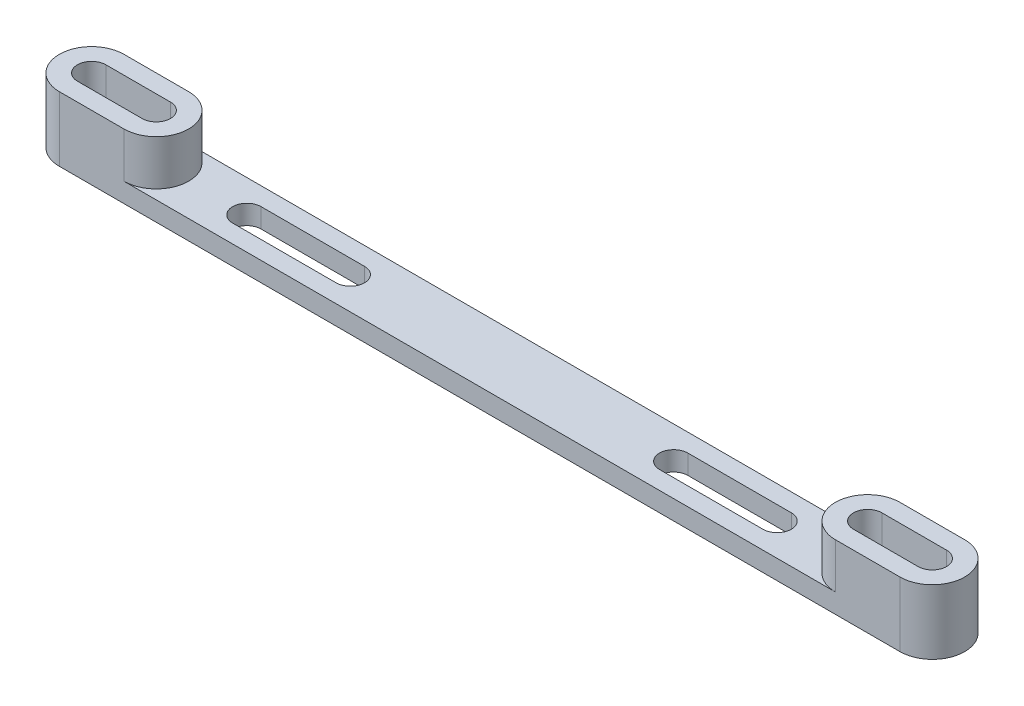
ISO-10303-21;
HEADER;
FILE_DESCRIPTION(('STEP AP214'),'2;1');
FILE_NAME('part.step','',(''),(''),'','','');
FILE_SCHEMA(('AUTOMOTIVE_DESIGN { 1 0 10303 214 1 1 1 1 }'));
ENDSEC;
DATA;
#1=APPLICATION_CONTEXT('core data for automotive mechanical design processes');
#2=APPLICATION_PROTOCOL_DEFINITION('international standard','automotive_design',2000,#1);
#3=PRODUCT_CONTEXT('',#1,'mechanical');
#4=PRODUCT('Part','Part','',(#3));
#5=PRODUCT_RELATED_PRODUCT_CATEGORY('part','',(#4));
#6=PRODUCT_DEFINITION_FORMATION('','',#4);
#7=PRODUCT_DEFINITION_CONTEXT('part definition',#1,'design');
#8=PRODUCT_DEFINITION('design','',#6,#7);
#9=PRODUCT_DEFINITION_SHAPE('','',#8);
#10=(LENGTH_UNIT() NAMED_UNIT(*) SI_UNIT(.MILLI.,.METRE.));
#11=(NAMED_UNIT(*) PLANE_ANGLE_UNIT() SI_UNIT($,.RADIAN.));
#12=(NAMED_UNIT(*) SI_UNIT($,.STERADIAN.) SOLID_ANGLE_UNIT());
#13=UNCERTAINTY_MEASURE_WITH_UNIT(LENGTH_MEASURE(1.E-05),#10,'distance_accuracy_value','');
#14=(GEOMETRIC_REPRESENTATION_CONTEXT(3) GLOBAL_UNCERTAINTY_ASSIGNED_CONTEXT((#13)) GLOBAL_UNIT_ASSIGNED_CONTEXT((#10,
#11,#12)) REPRESENTATION_CONTEXT('',''));
#15=CARTESIAN_POINT('',(0.,0.,0.));
#16=DIRECTION('',(0.,0.,1.));
#17=DIRECTION('',(1.,0.,0.));
#18=AXIS2_PLACEMENT_3D('',#15,#16,#17);
#19=CARTESIAN_POINT('',(-65.,3.,0.));
#20=DIRECTION('',(0.,1.,0.));
#21=DIRECTION('',(0.,0.,1.));
#22=AXIS2_PLACEMENT_3D('',#19,#20,#21);
#23=PLANE('',#22);
#24=CARTESIAN_POINT('',(41.,3.,0.));
#25=DIRECTION('',(0.,1.,0.));
#26=DIRECTION('',(0.,0.,-1.));
#27=AXIS2_PLACEMENT_3D('',#24,#25,#26);
#28=CIRCLE('',#27,2.20000000000001);
#29=CARTESIAN_POINT('',(41.,3.,2.20000000000003));
#30=VERTEX_POINT('',#29);
#31=CARTESIAN_POINT('',(41.,3.,-2.19999999999999));
#32=VERTEX_POINT('',#31);
#33=EDGE_CURVE('E53',#30,#32,#28,.T.);
#34=ORIENTED_EDGE('',*,*,#33,.F.);
#35=DIRECTION('',(1.,0.,0.));
#36=VECTOR('',#35,1.);
#37=CARTESIAN_POINT('',(41.,3.,2.20000000000003));
#38=LINE('',#37,#36);
#39=CARTESIAN_POINT('',(25.,3.,2.20000000000003));
#40=VERTEX_POINT('',#39);
#41=EDGE_CURVE('E217',#40,#30,#38,.T.);
#42=ORIENTED_EDGE('',*,*,#41,.F.);
#43=CARTESIAN_POINT('',(25.,3.,0.));
#44=DIRECTION('',(0.,1.,0.));
#45=DIRECTION('',(0.,0.,-1.));
#46=AXIS2_PLACEMENT_3D('',#43,#44,#45);
#47=CIRCLE('',#46,2.20000000000001);
#48=CARTESIAN_POINT('',(25.,3.,-2.19999999999998));
#49=VERTEX_POINT('',#48);
#50=EDGE_CURVE('E220',#49,#40,#47,.T.);
#51=ORIENTED_EDGE('',*,*,#50,.F.);
#52=DIRECTION('',(-1.,0.,0.));
#53=VECTOR('',#52,1.);
#54=CARTESIAN_POINT('',(41.,3.,-2.19999999999999));
#55=LINE('',#54,#53);
#56=EDGE_CURVE('E226',#32,#49,#55,.T.);
#57=ORIENTED_EDGE('',*,*,#56,.F.);
#58=EDGE_LOOP('',(#34,#42,#51,#57));
#59=FACE_BOUND('',#58,.T.);
#60=CARTESIAN_POINT('',(-41.,3.,0.));
#61=DIRECTION('',(0.,1.,0.));
#62=DIRECTION('',(0.,0.,1.));
#63=AXIS2_PLACEMENT_3D('',#60,#61,#62);
#64=CIRCLE('',#63,2.20000000000001);
#65=CARTESIAN_POINT('',(-41.,3.,-2.19999999999998));
#66=VERTEX_POINT('',#65);
#67=CARTESIAN_POINT('',(-41.,3.,2.20000000000004));
#68=VERTEX_POINT('',#67);
#69=EDGE_CURVE('E232',#66,#68,#64,.T.);
#70=ORIENTED_EDGE('',*,*,#69,.F.);
#71=DIRECTION('',(-1.,0.,0.));
#72=VECTOR('',#71,1.);
#73=CARTESIAN_POINT('',(-41.,3.,-2.19999999999998));
#74=LINE('',#73,#72);
#75=CARTESIAN_POINT('',(-25.,3.,-2.19999999999998));
#76=VERTEX_POINT('',#75);
#77=EDGE_CURVE('E240',#76,#66,#74,.T.);
#78=ORIENTED_EDGE('',*,*,#77,.F.);
#79=CARTESIAN_POINT('',(-25.,3.,0.));
#80=DIRECTION('',(0.,1.,0.));
#81=DIRECTION('',(0.,0.,1.));
#82=AXIS2_PLACEMENT_3D('',#79,#80,#81);
#83=CIRCLE('',#82,2.20000000000001);
#84=CARTESIAN_POINT('',(-25.,3.,2.20000000000003));
#85=VERTEX_POINT('',#84);
#86=EDGE_CURVE('E254',#85,#76,#83,.T.);
#87=ORIENTED_EDGE('',*,*,#86,.F.);
#88=DIRECTION('',(1.,0.,0.));
#89=VECTOR('',#88,1.);
#90=CARTESIAN_POINT('',(-41.,3.,2.20000000000004));
#91=LINE('',#90,#89);
#92=EDGE_CURVE('E251',#68,#85,#91,.T.);
#93=ORIENTED_EDGE('',*,*,#92,.F.);
#94=EDGE_LOOP('',(#70,#78,#87,#93));
#95=FACE_BOUND('',#94,.T.);
#96=DIRECTION('',(1.,0.,0.));
#97=VECTOR('',#96,1.);
#98=CARTESIAN_POINT('',(-65.,3.,4.99999999999998));
#99=LINE('',#98,#97);
#100=CARTESIAN_POINT('',(-55.,3.,4.99999999999997));
#101=VERTEX_POINT('',#100);
#102=CARTESIAN_POINT('',(55.,3.,4.99999999999995));
#103=VERTEX_POINT('',#102);
#104=EDGE_CURVE('E369',#101,#103,#99,.T.);
#105=ORIENTED_EDGE('',*,*,#104,.T.);
#106=CARTESIAN_POINT('',(55.,3.,0.));
#107=DIRECTION('',(0.,1.,0.));
#108=DIRECTION('',(0.,0.,-1.));
#109=AXIS2_PLACEMENT_3D('',#106,#107,#108);
#110=CIRCLE('',#109,5.);
#111=CARTESIAN_POINT('',(55.,3.,-5.));
#112=VERTEX_POINT('',#111);
#113=EDGE_CURVE('E325',#112,#103,#110,.T.);
#114=ORIENTED_EDGE('',*,*,#113,.F.);
#115=DIRECTION('',(-1.,0.,0.));
#116=VECTOR('',#115,1.);
#117=CARTESIAN_POINT('',(-65.,3.,-4.99999999999998));
#118=LINE('',#117,#116);
#119=CARTESIAN_POINT('',(-55.,3.,-5.));
#120=VERTEX_POINT('',#119);
#121=EDGE_CURVE('E39',#112,#120,#118,.T.);
#122=ORIENTED_EDGE('',*,*,#121,.T.);
#123=CARTESIAN_POINT('',(-55.,3.,0.));
#124=DIRECTION('',(0.,1.,0.));
#125=DIRECTION('',(0.,0.,1.));
#126=AXIS2_PLACEMENT_3D('',#123,#124,#125);
#127=CIRCLE('',#126,5.);
#128=EDGE_CURVE('E350',#101,#120,#127,.T.);
#129=ORIENTED_EDGE('',*,*,#128,.F.);
#130=EDGE_LOOP('',(#105,#114,#122,#129));
#131=FACE_BOUND('',#130,.T.);
#132=ADVANCED_FACE('F35',(#59,#95,#131),#23,.T.);
#133=CARTESIAN_POINT('',(-65.,3.,0.));
#134=DIRECTION('',(0.,-1.,0.));
#135=DIRECTION('',(0.,0.,-1.));
#136=AXIS2_PLACEMENT_3D('',#133,#134,#135);
#137=CYLINDRICAL_SURFACE('',#136,4.99999999999998);
#138=CARTESIAN_POINT('',(-65.,0.,0.));
#139=DIRECTION('',(0.,1.,0.));
#140=DIRECTION('',(0.,0.,1.));
#141=AXIS2_PLACEMENT_3D('',#138,#139,#140);
#142=CIRCLE('',#141,4.99999999999998);
#143=CARTESIAN_POINT('',(-65.,0.,-4.99999999999998));
#144=VERTEX_POINT('',#143);
#145=CARTESIAN_POINT('',(-65.,0.,4.99999999999998));
#146=VERTEX_POINT('',#145);
#147=EDGE_CURVE('E376',#144,#146,#142,.T.);
#148=ORIENTED_EDGE('',*,*,#147,.T.);
#149=DIRECTION('',(0.,-1.,0.));
#150=VECTOR('',#149,1.);
#151=CARTESIAN_POINT('',(-65.,3.,4.99999999999998));
#152=LINE('',#151,#150);
#153=CARTESIAN_POINT('',(-65.,10.,5.));
#154=VERTEX_POINT('',#153);
#155=EDGE_CURVE('E11',#154,#146,#152,.T.);
#156=ORIENTED_EDGE('',*,*,#155,.F.);
#157=CARTESIAN_POINT('',(-65.,10.,0.));
#158=DIRECTION('',(0.,1.,0.));
#159=DIRECTION('',(0.,0.,1.));
#160=AXIS2_PLACEMENT_3D('',#157,#158,#159);
#161=CIRCLE('',#160,5.);
#162=CARTESIAN_POINT('',(-65.,10.,-5.));
#163=VERTEX_POINT('',#162);
#164=EDGE_CURVE('E351',#163,#154,#161,.T.);
#165=ORIENTED_EDGE('',*,*,#164,.F.);
#166=DIRECTION('',(0.,-1.,0.));
#167=VECTOR('',#166,1.);
#168=CARTESIAN_POINT('',(-65.,3.,-4.99999999999998));
#169=LINE('',#168,#167);
#170=EDGE_CURVE('E394',#163,#144,#169,.T.);
#171=ORIENTED_EDGE('',*,*,#170,.T.);
#172=EDGE_LOOP('',(#148,#156,#165,#171));
#173=FACE_BOUND('',#172,.T.);
#174=ADVANCED_FACE('F37',(#173),#137,.T.);
#175=CARTESIAN_POINT('',(-65.,3.,4.99999999999998));
#176=DIRECTION('',(0.,0.,-1.));
#177=DIRECTION('',(-1.,0.,0.));
#178=AXIS2_PLACEMENT_3D('',#175,#176,#177);
#179=PLANE('',#178);
#180=DIRECTION('',(1.,0.,0.));
#181=VECTOR('',#180,1.);
#182=CARTESIAN_POINT('',(-65.,0.,4.99999999999998));
#183=LINE('',#182,#181);
#184=CARTESIAN_POINT('',(65.,0.,4.99999999999998));
#185=VERTEX_POINT('',#184);
#186=EDGE_CURVE('E382',#146,#185,#183,.T.);
#187=ORIENTED_EDGE('',*,*,#186,.T.);
#188=DIRECTION('',(0.,-1.,0.));
#189=VECTOR('',#188,1.);
#190=CARTESIAN_POINT('',(65.,3.,4.99999999999998));
#191=LINE('',#190,#189);
#192=CARTESIAN_POINT('',(65.,10.,4.99999999999998));
#193=VERTEX_POINT('',#192);
#194=EDGE_CURVE('E45',#193,#185,#191,.T.);
#195=ORIENTED_EDGE('',*,*,#194,.F.);
#196=DIRECTION('',(1.,0.,0.));
#197=VECTOR('',#196,1.);
#198=CARTESIAN_POINT('',(65.,10.,4.99999999999998));
#199=LINE('',#198,#197);
#200=CARTESIAN_POINT('',(55.,10.,4.99999999999999));
#201=VERTEX_POINT('',#200);
#202=EDGE_CURVE('E339',#201,#193,#199,.T.);
#203=ORIENTED_EDGE('',*,*,#202,.F.);
#204=DIRECTION('',(0.,-1.,0.));
#205=VECTOR('',#204,1.);
#206=CARTESIAN_POINT('',(55.,10.,4.99999999999999));
#207=LINE('',#206,#205);
#208=EDGE_CURVE('E342',#201,#103,#207,.T.);
#209=ORIENTED_EDGE('',*,*,#208,.T.);
#210=ORIENTED_EDGE('',*,*,#104,.F.);
#211=DIRECTION('',(0.,-1.,0.));
#212=VECTOR('',#211,1.);
#213=CARTESIAN_POINT('',(-55.,10.,5.));
#214=LINE('',#213,#212);
#215=CARTESIAN_POINT('',(-55.,10.,5.));
#216=VERTEX_POINT('',#215);
#217=EDGE_CURVE('E372',#216,#101,#214,.T.);
#218=ORIENTED_EDGE('',*,*,#217,.F.);
#219=DIRECTION('',(1.,0.,0.));
#220=VECTOR('',#219,1.);
#221=CARTESIAN_POINT('',(-65.,10.,5.));
#222=LINE('',#221,#220);
#223=EDGE_CURVE('E354',#154,#216,#222,.T.);
#224=ORIENTED_EDGE('',*,*,#223,.F.);
#225=ORIENTED_EDGE('',*,*,#155,.T.);
#226=EDGE_LOOP('',(#187,#195,#203,#209,#210,#218,#224,#225));
#227=FACE_BOUND('',#226,.T.);
#228=ADVANCED_FACE('F422',(#227),#179,.F.);
#229=CARTESIAN_POINT('',(65.,3.,0.));
#230=DIRECTION('',(0.,-1.,0.));
#231=DIRECTION('',(0.,0.,-1.));
#232=AXIS2_PLACEMENT_3D('',#229,#230,#231);
#233=CYLINDRICAL_SURFACE('',#232,4.99999999999998);
#234=CARTESIAN_POINT('',(65.,0.,0.));
#235=DIRECTION('',(0.,1.,0.));
#236=DIRECTION('',(0.,0.,1.));
#237=AXIS2_PLACEMENT_3D('',#234,#235,#236);
#238=CIRCLE('',#237,4.99999999999998);
#239=CARTESIAN_POINT('',(65.,0.,-5.));
#240=VERTEX_POINT('',#239);
#241=EDGE_CURVE('E387',#185,#240,#238,.T.);
#242=ORIENTED_EDGE('',*,*,#241,.T.);
#243=DIRECTION('',(0.,-1.,0.));
#244=VECTOR('',#243,1.);
#245=CARTESIAN_POINT('',(65.,3.,-5.));
#246=LINE('',#245,#244);
#247=CARTESIAN_POINT('',(65.,10.,-5.00000000000002));
#248=VERTEX_POINT('',#247);
#249=EDGE_CURVE('E396',#248,#240,#246,.T.);
#250=ORIENTED_EDGE('',*,*,#249,.F.);
#251=CARTESIAN_POINT('',(65.,10.,0.));
#252=DIRECTION('',(0.,1.,0.));
#253=DIRECTION('',(0.,0.,-1.));
#254=AXIS2_PLACEMENT_3D('',#251,#252,#253);
#255=CIRCLE('',#254,5.);
#256=EDGE_CURVE('E332',#193,#248,#255,.T.);
#257=ORIENTED_EDGE('',*,*,#256,.F.);
#258=ORIENTED_EDGE('',*,*,#194,.T.);
#259=EDGE_LOOP('',(#242,#250,#257,#258));
#260=FACE_BOUND('',#259,.T.);
#261=ADVANCED_FACE('F403',(#260),#233,.T.);
#262=CARTESIAN_POINT('',(-65.,3.,-4.99999999999998));
#263=DIRECTION('',(0.,0.,1.));
#264=DIRECTION('',(1.,0.,0.));
#265=AXIS2_PLACEMENT_3D('',#262,#263,#264);
#266=PLANE('',#265);
#267=DIRECTION('',(-1.,0.,0.));
#268=VECTOR('',#267,1.);
#269=CARTESIAN_POINT('',(-65.,0.,-4.99999999999998));
#270=LINE('',#269,#268);
#271=EDGE_CURVE('E392',#240,#144,#270,.T.);
#272=ORIENTED_EDGE('',*,*,#271,.T.);
#273=ORIENTED_EDGE('',*,*,#170,.F.);
#274=DIRECTION('',(-1.,0.,0.));
#275=VECTOR('',#274,1.);
#276=CARTESIAN_POINT('',(-65.,10.,-5.));
#277=LINE('',#276,#275);
#278=CARTESIAN_POINT('',(-55.,10.,-5.));
#279=VERTEX_POINT('',#278);
#280=EDGE_CURVE('E358',#279,#163,#277,.T.);
#281=ORIENTED_EDGE('',*,*,#280,.F.);
#282=DIRECTION('',(0.,-1.,0.));
#283=VECTOR('',#282,1.);
#284=CARTESIAN_POINT('',(-55.,10.,-5.));
#285=LINE('',#284,#283);
#286=EDGE_CURVE('E361',#279,#120,#285,.T.);
#287=ORIENTED_EDGE('',*,*,#286,.T.);
#288=ORIENTED_EDGE('',*,*,#121,.F.);
#289=DIRECTION('',(0.,-1.,0.));
#290=VECTOR('',#289,1.);
#291=CARTESIAN_POINT('',(55.,10.,-5.00000000000002));
#292=LINE('',#291,#290);
#293=CARTESIAN_POINT('',(55.,10.,-5.00000000000002));
#294=VERTEX_POINT('',#293);
#295=EDGE_CURVE('E347',#294,#112,#292,.T.);
#296=ORIENTED_EDGE('',*,*,#295,.F.);
#297=DIRECTION('',(-1.,0.,0.));
#298=VECTOR('',#297,1.);
#299=CARTESIAN_POINT('',(65.,10.,-5.00000000000002));
#300=LINE('',#299,#298);
#301=EDGE_CURVE('E335',#248,#294,#300,.T.);
#302=ORIENTED_EDGE('',*,*,#301,.F.);
#303=ORIENTED_EDGE('',*,*,#249,.T.);
#304=EDGE_LOOP('',(#272,#273,#281,#287,#288,#296,#302,#303));
#305=FACE_BOUND('',#304,.T.);
#306=ADVANCED_FACE('F409',(#305),#266,.F.);
#307=CARTESIAN_POINT('',(-65.,0.,0.));
#308=DIRECTION('',(0.,1.,0.));
#309=DIRECTION('',(0.,0.,1.));
#310=AXIS2_PLACEMENT_3D('',#307,#308,#309);
#311=PLANE('',#310);
#312=DIRECTION('',(1.,0.,0.));
#313=VECTOR('',#312,1.);
#314=CARTESIAN_POINT('',(41.,0.,2.20000000000003));
#315=LINE('',#314,#313);
#316=CARTESIAN_POINT('',(25.,0.,2.20000000000003));
#317=VERTEX_POINT('',#316);
#318=CARTESIAN_POINT('',(41.,0.,2.20000000000003));
#319=VERTEX_POINT('',#318);
#320=EDGE_CURVE('E207',#317,#319,#315,.T.);
#321=ORIENTED_EDGE('',*,*,#320,.T.);
#322=CARTESIAN_POINT('',(41.,0.,0.));
#323=DIRECTION('',(0.,1.,0.));
#324=DIRECTION('',(0.,0.,-1.));
#325=AXIS2_PLACEMENT_3D('',#322,#323,#324);
#326=CIRCLE('',#325,2.20000000000001);
#327=CARTESIAN_POINT('',(41.,0.,-2.19999999999999));
#328=VERTEX_POINT('',#327);
#329=EDGE_CURVE('E201',#319,#328,#326,.T.);
#330=ORIENTED_EDGE('',*,*,#329,.T.);
#331=DIRECTION('',(-1.,0.,0.));
#332=VECTOR('',#331,1.);
#333=CARTESIAN_POINT('',(41.,0.,-2.19999999999999));
#334=LINE('',#333,#332);
#335=CARTESIAN_POINT('',(25.,0.,-2.19999999999998));
#336=VERTEX_POINT('',#335);
#337=EDGE_CURVE('E210',#328,#336,#334,.T.);
#338=ORIENTED_EDGE('',*,*,#337,.T.);
#339=CARTESIAN_POINT('',(25.,0.,0.));
#340=DIRECTION('',(0.,1.,0.));
#341=DIRECTION('',(0.,0.,-1.));
#342=AXIS2_PLACEMENT_3D('',#339,#340,#341);
#343=CIRCLE('',#342,2.20000000000001);
#344=EDGE_CURVE('E61',#336,#317,#343,.T.);
#345=ORIENTED_EDGE('',*,*,#344,.T.);
#346=EDGE_LOOP('',(#321,#330,#338,#345));
#347=FACE_BOUND('',#346,.T.);
#348=DIRECTION('',(-1.,0.,0.));
#349=VECTOR('',#348,1.);
#350=CARTESIAN_POINT('',(-41.,0.,-2.19999999999998));
#351=LINE('',#350,#349);
#352=CARTESIAN_POINT('',(-25.,0.,-2.19999999999998));
#353=VERTEX_POINT('',#352);
#354=CARTESIAN_POINT('',(-41.,0.,-2.19999999999998));
#355=VERTEX_POINT('',#354);
#356=EDGE_CURVE('E246',#353,#355,#351,.T.);
#357=ORIENTED_EDGE('',*,*,#356,.T.);
#358=CARTESIAN_POINT('',(-41.,0.,0.));
#359=DIRECTION('',(0.,1.,0.));
#360=DIRECTION('',(0.,0.,1.));
#361=AXIS2_PLACEMENT_3D('',#358,#359,#360);
#362=CIRCLE('',#361,2.20000000000001);
#363=CARTESIAN_POINT('',(-41.,0.,2.20000000000004));
#364=VERTEX_POINT('',#363);
#365=EDGE_CURVE('E236',#355,#364,#362,.T.);
#366=ORIENTED_EDGE('',*,*,#365,.T.);
#367=DIRECTION('',(1.,0.,0.));
#368=VECTOR('',#367,1.);
#369=CARTESIAN_POINT('',(-41.,0.,2.20000000000004));
#370=LINE('',#369,#368);
#371=CARTESIAN_POINT('',(-25.,0.,2.20000000000004));
#372=VERTEX_POINT('',#371);
#373=EDGE_CURVE('E239',#364,#372,#370,.T.);
#374=ORIENTED_EDGE('',*,*,#373,.T.);
#375=CARTESIAN_POINT('',(-25.,0.,0.));
#376=DIRECTION('',(0.,1.,0.));
#377=DIRECTION('',(0.,0.,1.));
#378=AXIS2_PLACEMENT_3D('',#375,#376,#377);
#379=CIRCLE('',#378,2.20000000000001);
#380=EDGE_CURVE('E243',#372,#353,#379,.T.);
#381=ORIENTED_EDGE('',*,*,#380,.T.);
#382=EDGE_LOOP('',(#357,#366,#374,#381));
#383=FACE_BOUND('',#382,.T.);
#384=DIRECTION('',(1.,0.,0.));
#385=VECTOR('',#384,1.);
#386=CARTESIAN_POINT('',(65.,0.,2.20000000000004));
#387=LINE('',#386,#385);
#388=CARTESIAN_POINT('',(55.,0.,2.2));
#389=VERTEX_POINT('',#388);
#390=CARTESIAN_POINT('',(65.,0.,2.20000000000004));
#391=VERTEX_POINT('',#390);
#392=EDGE_CURVE('E278',#389,#391,#387,.T.);
#393=ORIENTED_EDGE('',*,*,#392,.T.);
#394=CARTESIAN_POINT('',(65.,0.,0.));
#395=DIRECTION('',(0.,1.,0.));
#396=DIRECTION('',(0.,0.,-1.));
#397=AXIS2_PLACEMENT_3D('',#394,#395,#396);
#398=CIRCLE('',#397,2.20000000000002);
#399=CARTESIAN_POINT('',(65.,0.,-2.19999999999999));
#400=VERTEX_POINT('',#399);
#401=EDGE_CURVE('E268',#391,#400,#398,.T.);
#402=ORIENTED_EDGE('',*,*,#401,.T.);
#403=DIRECTION('',(-1.,0.,0.));
#404=VECTOR('',#403,1.);
#405=CARTESIAN_POINT('',(65.,0.,-2.19999999999999));
#406=LINE('',#405,#404);
#407=CARTESIAN_POINT('',(55.,0.,-2.19999999999999));
#408=VERTEX_POINT('',#407);
#409=EDGE_CURVE('E271',#400,#408,#406,.T.);
#410=ORIENTED_EDGE('',*,*,#409,.T.);
#411=CARTESIAN_POINT('',(55.,0.,0.));
#412=DIRECTION('',(0.,1.,0.));
#413=DIRECTION('',(0.,0.,-1.));
#414=AXIS2_PLACEMENT_3D('',#411,#412,#413);
#415=CIRCLE('',#414,2.20000000000002);
#416=EDGE_CURVE('E275',#408,#389,#415,.T.);
#417=ORIENTED_EDGE('',*,*,#416,.T.);
#418=EDGE_LOOP('',(#393,#402,#410,#417));
#419=FACE_BOUND('',#418,.T.);
#420=DIRECTION('',(-1.,0.,0.));
#421=VECTOR('',#420,1.);
#422=CARTESIAN_POINT('',(-65.,0.,-2.19999999999998));
#423=LINE('',#422,#421);
#424=CARTESIAN_POINT('',(-55.,0.,-2.19999999999998));
#425=VERTEX_POINT('',#424);
#426=CARTESIAN_POINT('',(-65.,0.,-2.19999999999998));
#427=VERTEX_POINT('',#426);
#428=EDGE_CURVE('E310',#425,#427,#423,.T.);
#429=ORIENTED_EDGE('',*,*,#428,.T.);
#430=CARTESIAN_POINT('',(-65.,0.,0.));
#431=DIRECTION('',(0.,1.,0.));
#432=DIRECTION('',(0.,0.,1.));
#433=AXIS2_PLACEMENT_3D('',#430,#431,#432);
#434=CIRCLE('',#433,2.20000000000002);
#435=CARTESIAN_POINT('',(-65.,0.,2.20000000000006));
#436=VERTEX_POINT('',#435);
#437=EDGE_CURVE('E300',#427,#436,#434,.T.);
#438=ORIENTED_EDGE('',*,*,#437,.T.);
#439=DIRECTION('',(1.,0.,0.));
#440=VECTOR('',#439,1.);
#441=CARTESIAN_POINT('',(-65.,0.,2.20000000000006));
#442=LINE('',#441,#440);
#443=CARTESIAN_POINT('',(-55.,0.,2.20000000000006));
#444=VERTEX_POINT('',#443);
#445=EDGE_CURVE('E303',#436,#444,#442,.T.);
#446=ORIENTED_EDGE('',*,*,#445,.T.);
#447=CARTESIAN_POINT('',(-55.,0.,0.));
#448=DIRECTION('',(0.,1.,0.));
#449=DIRECTION('',(0.,0.,1.));
#450=AXIS2_PLACEMENT_3D('',#447,#448,#449);
#451=CIRCLE('',#450,2.20000000000002);
#452=EDGE_CURVE('E307',#444,#425,#451,.T.);
#453=ORIENTED_EDGE('',*,*,#452,.T.);
#454=EDGE_LOOP('',(#429,#438,#446,#453));
#455=FACE_BOUND('',#454,.T.);
#456=ORIENTED_EDGE('',*,*,#147,.F.);
#457=ORIENTED_EDGE('',*,*,#271,.F.);
#458=ORIENTED_EDGE('',*,*,#241,.F.);
#459=ORIENTED_EDGE('',*,*,#186,.F.);
#460=EDGE_LOOP('',(#456,#457,#458,#459));
#461=FACE_BOUND('',#460,.T.);
#462=ADVANCED_FACE('F214',(#347,#383,#419,#455,#461),#311,.F.);
#463=CARTESIAN_POINT('',(-55.,10.,0.));
#464=DIRECTION('',(0.,-1.,0.));
#465=DIRECTION('',(0.,0.,-1.));
#466=AXIS2_PLACEMENT_3D('',#463,#464,#465);
#467=CYLINDRICAL_SURFACE('',#466,5.);
#468=ORIENTED_EDGE('',*,*,#128,.T.);
#469=ORIENTED_EDGE('',*,*,#286,.F.);
#470=CARTESIAN_POINT('',(-55.,10.,0.));
#471=DIRECTION('',(0.,1.,0.));
#472=DIRECTION('',(0.,0.,1.));
#473=AXIS2_PLACEMENT_3D('',#470,#471,#472);
#474=CIRCLE('',#473,5.);
#475=EDGE_CURVE('E356',#216,#279,#474,.T.);
#476=ORIENTED_EDGE('',*,*,#475,.F.);
#477=ORIENTED_EDGE('',*,*,#217,.T.);
#478=EDGE_LOOP('',(#468,#469,#476,#477));
#479=FACE_BOUND('',#478,.T.);
#480=ADVANCED_FACE('F419',(#479),#467,.T.);
#481=CARTESIAN_POINT('',(-65.,10.,0.));
#482=DIRECTION('',(0.,1.,0.));
#483=DIRECTION('',(0.,0.,1.));
#484=AXIS2_PLACEMENT_3D('',#481,#482,#483);
#485=PLANE('',#484);
#486=CARTESIAN_POINT('',(-65.,10.,0.));
#487=DIRECTION('',(0.,1.,0.));
#488=DIRECTION('',(0.,0.,1.));
#489=AXIS2_PLACEMENT_3D('',#486,#487,#488);
#490=CIRCLE('',#489,2.20000000000002);
#491=CARTESIAN_POINT('',(-65.,10.,-2.19999999999998));
#492=VERTEX_POINT('',#491);
#493=CARTESIAN_POINT('',(-65.,10.,2.20000000000006));
#494=VERTEX_POINT('',#493);
#495=EDGE_CURVE('E293',#492,#494,#490,.T.);
#496=ORIENTED_EDGE('',*,*,#495,.F.);
#497=DIRECTION('',(-1.,0.,0.));
#498=VECTOR('',#497,1.);
#499=CARTESIAN_POINT('',(-65.,10.,-2.19999999999998));
#500=LINE('',#499,#498);
#501=CARTESIAN_POINT('',(-55.,10.,-2.19999999999998));
#502=VERTEX_POINT('',#501);
#503=EDGE_CURVE('E304',#502,#492,#500,.T.);
#504=ORIENTED_EDGE('',*,*,#503,.F.);
#505=CARTESIAN_POINT('',(-55.,10.,0.));
#506=DIRECTION('',(0.,1.,0.));
#507=DIRECTION('',(0.,0.,1.));
#508=AXIS2_PLACEMENT_3D('',#505,#506,#507);
#509=CIRCLE('',#508,2.20000000000002);
#510=CARTESIAN_POINT('',(-55.,10.,2.20000000000002));
#511=VERTEX_POINT('',#510);
#512=EDGE_CURVE('E318',#511,#502,#509,.T.);
#513=ORIENTED_EDGE('',*,*,#512,.F.);
#514=DIRECTION('',(1.,0.,0.));
#515=VECTOR('',#514,1.);
#516=CARTESIAN_POINT('',(-65.,10.,2.20000000000006));
#517=LINE('',#516,#515);
#518=EDGE_CURVE('E315',#494,#511,#517,.T.);
#519=ORIENTED_EDGE('',*,*,#518,.F.);
#520=EDGE_LOOP('',(#496,#504,#513,#519));
#521=FACE_BOUND('',#520,.T.);
#522=ORIENTED_EDGE('',*,*,#164,.T.);
#523=ORIENTED_EDGE('',*,*,#223,.T.);
#524=ORIENTED_EDGE('',*,*,#475,.T.);
#525=ORIENTED_EDGE('',*,*,#280,.T.);
#526=EDGE_LOOP('',(#522,#523,#524,#525));
#527=FACE_BOUND('',#526,.T.);
#528=ADVANCED_FACE('F415',(#521,#527),#485,.T.);
#529=CARTESIAN_POINT('',(55.,10.,0.));
#530=DIRECTION('',(0.,-1.,0.));
#531=DIRECTION('',(0.,0.,-1.));
#532=AXIS2_PLACEMENT_3D('',#529,#530,#531);
#533=CYLINDRICAL_SURFACE('',#532,5.);
#534=ORIENTED_EDGE('',*,*,#113,.T.);
#535=ORIENTED_EDGE('',*,*,#208,.F.);
#536=CARTESIAN_POINT('',(55.,10.,0.));
#537=DIRECTION('',(0.,1.,0.));
#538=DIRECTION('',(0.,0.,-1.));
#539=AXIS2_PLACEMENT_3D('',#536,#537,#538);
#540=CIRCLE('',#539,5.);
#541=EDGE_CURVE('E337',#294,#201,#540,.T.);
#542=ORIENTED_EDGE('',*,*,#541,.F.);
#543=ORIENTED_EDGE('',*,*,#295,.T.);
#544=EDGE_LOOP('',(#534,#535,#542,#543));
#545=FACE_BOUND('',#544,.T.);
#546=ADVANCED_FACE('F426',(#545),#533,.T.);
#547=CARTESIAN_POINT('',(65.,10.,0.));
#548=DIRECTION('',(0.,-1.,0.));
#549=DIRECTION('',(0.,0.,-1.));
#550=AXIS2_PLACEMENT_3D('',#547,#548,#549);
#551=PLANE('',#550);
#552=DIRECTION('',(-1.,0.,0.));
#553=VECTOR('',#552,1.);
#554=CARTESIAN_POINT('',(65.,10.,-2.19999999999999));
#555=LINE('',#554,#553);
#556=CARTESIAN_POINT('',(65.,10.,-2.19999999999999));
#557=VERTEX_POINT('',#556);
#558=CARTESIAN_POINT('',(55.,10.,-2.19999999999999));
#559=VERTEX_POINT('',#558);
#560=EDGE_CURVE('E283',#557,#559,#555,.T.);
#561=ORIENTED_EDGE('',*,*,#560,.F.);
#562=CARTESIAN_POINT('',(65.,10.,0.));
#563=DIRECTION('',(0.,1.,0.));
#564=DIRECTION('',(0.,0.,-1.));
#565=AXIS2_PLACEMENT_3D('',#562,#563,#564);
#566=CIRCLE('',#565,2.20000000000002);
#567=CARTESIAN_POINT('',(65.,10.,2.20000000000004));
#568=VERTEX_POINT('',#567);
#569=EDGE_CURVE('E261',#568,#557,#566,.T.);
#570=ORIENTED_EDGE('',*,*,#569,.F.);
#571=DIRECTION('',(1.,0.,0.));
#572=VECTOR('',#571,1.);
#573=CARTESIAN_POINT('',(65.,10.,2.20000000000004));
#574=LINE('',#573,#572);
#575=CARTESIAN_POINT('',(55.,10.,2.2));
#576=VERTEX_POINT('',#575);
#577=EDGE_CURVE('E272',#576,#568,#574,.T.);
#578=ORIENTED_EDGE('',*,*,#577,.F.);
#579=CARTESIAN_POINT('',(55.,10.,0.));
#580=DIRECTION('',(0.,1.,0.));
#581=DIRECTION('',(0.,0.,-1.));
#582=AXIS2_PLACEMENT_3D('',#579,#580,#581);
#583=CIRCLE('',#582,2.20000000000002);
#584=EDGE_CURVE('E286',#559,#576,#583,.T.);
#585=ORIENTED_EDGE('',*,*,#584,.F.);
#586=EDGE_LOOP('',(#561,#570,#578,#585));
#587=FACE_BOUND('',#586,.T.);
#588=ORIENTED_EDGE('',*,*,#256,.T.);
#589=ORIENTED_EDGE('',*,*,#301,.T.);
#590=ORIENTED_EDGE('',*,*,#541,.T.);
#591=ORIENTED_EDGE('',*,*,#202,.T.);
#592=EDGE_LOOP('',(#588,#589,#590,#591));
#593=FACE_BOUND('',#592,.T.);
#594=ADVANCED_FACE('F428',(#587,#593),#551,.F.);
#595=CARTESIAN_POINT('',(-65.,0.,0.));
#596=DIRECTION('',(0.,1.,0.));
#597=DIRECTION('',(0.,0.,1.));
#598=AXIS2_PLACEMENT_3D('',#595,#596,#597);
#599=CYLINDRICAL_SURFACE('',#598,2.20000000000002);
#600=ORIENTED_EDGE('',*,*,#495,.T.);
#601=DIRECTION('',(0.,1.,0.));
#602=VECTOR('',#601,1.);
#603=CARTESIAN_POINT('',(-65.,0.,2.20000000000006));
#604=LINE('',#603,#602);
#605=EDGE_CURVE('E313',#436,#494,#604,.T.);
#606=ORIENTED_EDGE('',*,*,#605,.F.);
#607=ORIENTED_EDGE('',*,*,#437,.F.);
#608=DIRECTION('',(0.,1.,0.));
#609=VECTOR('',#608,1.);
#610=CARTESIAN_POINT('',(-65.,0.,-2.19999999999998));
#611=LINE('',#610,#609);
#612=EDGE_CURVE('E323',#427,#492,#611,.T.);
#613=ORIENTED_EDGE('',*,*,#612,.T.);
#614=EDGE_LOOP('',(#600,#606,#607,#613));
#615=FACE_BOUND('',#614,.T.);
#616=ADVANCED_FACE('F430',(#615),#599,.F.);
#617=CARTESIAN_POINT('',(-65.,0.,-2.19999999999998));
#618=DIRECTION('',(0.,0.,-1.));
#619=DIRECTION('',(-1.,0.,0.));
#620=AXIS2_PLACEMENT_3D('',#617,#618,#619);
#621=PLANE('',#620);
#622=ORIENTED_EDGE('',*,*,#503,.T.);
#623=ORIENTED_EDGE('',*,*,#612,.F.);
#624=ORIENTED_EDGE('',*,*,#428,.F.);
#625=DIRECTION('',(0.,1.,0.));
#626=VECTOR('',#625,1.);
#627=CARTESIAN_POINT('',(-55.,0.,-2.19999999999998));
#628=LINE('',#627,#626);
#629=EDGE_CURVE('E326',#425,#502,#628,.T.);
#630=ORIENTED_EDGE('',*,*,#629,.T.);
#631=EDGE_LOOP('',(#622,#623,#624,#630));
#632=FACE_BOUND('',#631,.T.);
#633=ADVANCED_FACE('F437',(#632),#621,.F.);
#634=CARTESIAN_POINT('',(-55.,0.,0.));
#635=DIRECTION('',(0.,1.,0.));
#636=DIRECTION('',(0.,0.,1.));
#637=AXIS2_PLACEMENT_3D('',#634,#635,#636);
#638=CYLINDRICAL_SURFACE('',#637,2.20000000000002);
#639=ORIENTED_EDGE('',*,*,#512,.T.);
#640=ORIENTED_EDGE('',*,*,#629,.F.);
#641=ORIENTED_EDGE('',*,*,#452,.F.);
#642=DIRECTION('',(0.,1.,0.));
#643=VECTOR('',#642,1.);
#644=CARTESIAN_POINT('',(-55.,0.,2.20000000000002));
#645=LINE('',#644,#643);
#646=EDGE_CURVE('E328',#444,#511,#645,.T.);
#647=ORIENTED_EDGE('',*,*,#646,.T.);
#648=EDGE_LOOP('',(#639,#640,#641,#647));
#649=FACE_BOUND('',#648,.T.);
#650=ADVANCED_FACE('F511',(#649),#638,.F.);
#651=CARTESIAN_POINT('',(-65.,0.,2.20000000000006));
#652=DIRECTION('',(0.,0.,1.));
#653=DIRECTION('',(1.,0.,0.));
#654=AXIS2_PLACEMENT_3D('',#651,#652,#653);
#655=PLANE('',#654);
#656=ORIENTED_EDGE('',*,*,#518,.T.);
#657=ORIENTED_EDGE('',*,*,#646,.F.);
#658=ORIENTED_EDGE('',*,*,#445,.F.);
#659=ORIENTED_EDGE('',*,*,#605,.T.);
#660=EDGE_LOOP('',(#656,#657,#658,#659));
#661=FACE_BOUND('',#660,.T.);
#662=ADVANCED_FACE('F520',(#661),#655,.F.);
#663=CARTESIAN_POINT('',(65.,0.,0.));
#664=DIRECTION('',(0.,1.,0.));
#665=DIRECTION('',(0.,0.,1.));
#666=AXIS2_PLACEMENT_3D('',#663,#664,#665);
#667=CYLINDRICAL_SURFACE('',#666,2.20000000000002);
#668=ORIENTED_EDGE('',*,*,#569,.T.);
#669=DIRECTION('',(0.,1.,0.));
#670=VECTOR('',#669,1.);
#671=CARTESIAN_POINT('',(65.,0.,-2.19999999999999));
#672=LINE('',#671,#670);
#673=EDGE_CURVE('E281',#400,#557,#672,.T.);
#674=ORIENTED_EDGE('',*,*,#673,.F.);
#675=ORIENTED_EDGE('',*,*,#401,.F.);
#676=DIRECTION('',(0.,1.,0.));
#677=VECTOR('',#676,1.);
#678=CARTESIAN_POINT('',(65.,0.,2.20000000000004));
#679=LINE('',#678,#677);
#680=EDGE_CURVE('E291',#391,#568,#679,.T.);
#681=ORIENTED_EDGE('',*,*,#680,.T.);
#682=EDGE_LOOP('',(#668,#674,#675,#681));
#683=FACE_BOUND('',#682,.T.);
#684=ADVANCED_FACE('F529',(#683),#667,.F.);
#685=CARTESIAN_POINT('',(65.,0.,2.20000000000004));
#686=DIRECTION('',(0.,0.,1.));
#687=DIRECTION('',(1.,0.,0.));
#688=AXIS2_PLACEMENT_3D('',#685,#686,#687);
#689=PLANE('',#688);
#690=ORIENTED_EDGE('',*,*,#577,.T.);
#691=ORIENTED_EDGE('',*,*,#680,.F.);
#692=ORIENTED_EDGE('',*,*,#392,.F.);
#693=DIRECTION('',(0.,1.,0.));
#694=VECTOR('',#693,1.);
#695=CARTESIAN_POINT('',(55.,0.,2.2));
#696=LINE('',#695,#694);
#697=EDGE_CURVE('E294',#389,#576,#696,.T.);
#698=ORIENTED_EDGE('',*,*,#697,.T.);
#699=EDGE_LOOP('',(#690,#691,#692,#698));
#700=FACE_BOUND('',#699,.T.);
#701=ADVANCED_FACE('F538',(#700),#689,.F.);
#702=CARTESIAN_POINT('',(55.,0.,0.));
#703=DIRECTION('',(0.,1.,0.));
#704=DIRECTION('',(0.,0.,1.));
#705=AXIS2_PLACEMENT_3D('',#702,#703,#704);
#706=CYLINDRICAL_SURFACE('',#705,2.20000000000002);
#707=ORIENTED_EDGE('',*,*,#584,.T.);
#708=ORIENTED_EDGE('',*,*,#697,.F.);
#709=ORIENTED_EDGE('',*,*,#416,.F.);
#710=DIRECTION('',(0.,1.,0.));
#711=VECTOR('',#710,1.);
#712=CARTESIAN_POINT('',(55.,0.,-2.19999999999999));
#713=LINE('',#712,#711);
#714=EDGE_CURVE('E296',#408,#559,#713,.T.);
#715=ORIENTED_EDGE('',*,*,#714,.T.);
#716=EDGE_LOOP('',(#707,#708,#709,#715));
#717=FACE_BOUND('',#716,.T.);
#718=ADVANCED_FACE('F547',(#717),#706,.F.);
#719=CARTESIAN_POINT('',(65.,0.,-2.19999999999999));
#720=DIRECTION('',(0.,0.,-1.));
#721=DIRECTION('',(-1.,0.,0.));
#722=AXIS2_PLACEMENT_3D('',#719,#720,#721);
#723=PLANE('',#722);
#724=ORIENTED_EDGE('',*,*,#560,.T.);
#725=ORIENTED_EDGE('',*,*,#714,.F.);
#726=ORIENTED_EDGE('',*,*,#409,.F.);
#727=ORIENTED_EDGE('',*,*,#673,.T.);
#728=EDGE_LOOP('',(#724,#725,#726,#727));
#729=FACE_BOUND('',#728,.T.);
#730=ADVANCED_FACE('F556',(#729),#723,.F.);
#731=CARTESIAN_POINT('',(-41.,0.,0.));
#732=DIRECTION('',(0.,1.,0.));
#733=DIRECTION('',(0.,0.,1.));
#734=AXIS2_PLACEMENT_3D('',#731,#732,#733);
#735=CYLINDRICAL_SURFACE('',#734,2.20000000000001);
#736=ORIENTED_EDGE('',*,*,#69,.T.);
#737=DIRECTION('',(0.,1.,0.));
#738=VECTOR('',#737,1.);
#739=CARTESIAN_POINT('',(-41.,0.,2.20000000000004));
#740=LINE('',#739,#738);
#741=EDGE_CURVE('E249',#364,#68,#740,.T.);
#742=ORIENTED_EDGE('',*,*,#741,.F.);
#743=ORIENTED_EDGE('',*,*,#365,.F.);
#744=DIRECTION('',(0.,1.,0.));
#745=VECTOR('',#744,1.);
#746=CARTESIAN_POINT('',(-41.,0.,-2.19999999999998));
#747=LINE('',#746,#745);
#748=EDGE_CURVE('E259',#355,#66,#747,.T.);
#749=ORIENTED_EDGE('',*,*,#748,.T.);
#750=EDGE_LOOP('',(#736,#742,#743,#749));
#751=FACE_BOUND('',#750,.T.);
#752=ADVANCED_FACE('F565',(#751),#735,.F.);
#753=CARTESIAN_POINT('',(-41.,0.,-2.19999999999998));
#754=DIRECTION('',(0.,0.,-1.));
#755=DIRECTION('',(-1.,0.,0.));
#756=AXIS2_PLACEMENT_3D('',#753,#754,#755);
#757=PLANE('',#756);
#758=ORIENTED_EDGE('',*,*,#77,.T.);
#759=ORIENTED_EDGE('',*,*,#748,.F.);
#760=ORIENTED_EDGE('',*,*,#356,.F.);
#761=DIRECTION('',(0.,1.,0.));
#762=VECTOR('',#761,1.);
#763=CARTESIAN_POINT('',(-25.,0.,-2.19999999999998));
#764=LINE('',#763,#762);
#765=EDGE_CURVE('E262',#353,#76,#764,.T.);
#766=ORIENTED_EDGE('',*,*,#765,.T.);
#767=EDGE_LOOP('',(#758,#759,#760,#766));
#768=FACE_BOUND('',#767,.T.);
#769=ADVANCED_FACE('F573',(#768),#757,.F.);
#770=CARTESIAN_POINT('',(-25.,0.,0.));
#771=DIRECTION('',(0.,1.,0.));
#772=DIRECTION('',(0.,0.,1.));
#773=AXIS2_PLACEMENT_3D('',#770,#771,#772);
#774=CYLINDRICAL_SURFACE('',#773,2.20000000000001);
#775=ORIENTED_EDGE('',*,*,#86,.T.);
#776=ORIENTED_EDGE('',*,*,#765,.F.);
#777=ORIENTED_EDGE('',*,*,#380,.F.);
#778=DIRECTION('',(0.,1.,0.));
#779=VECTOR('',#778,1.);
#780=CARTESIAN_POINT('',(-25.,0.,2.20000000000003));
#781=LINE('',#780,#779);
#782=EDGE_CURVE('E264',#372,#85,#781,.T.);
#783=ORIENTED_EDGE('',*,*,#782,.T.);
#784=EDGE_LOOP('',(#775,#776,#777,#783));
#785=FACE_BOUND('',#784,.T.);
#786=ADVANCED_FACE('F582',(#785),#774,.F.);
#787=CARTESIAN_POINT('',(-41.,0.,2.20000000000004));
#788=DIRECTION('',(0.,0.,1.));
#789=DIRECTION('',(1.,0.,0.));
#790=AXIS2_PLACEMENT_3D('',#787,#788,#789);
#791=PLANE('',#790);
#792=ORIENTED_EDGE('',*,*,#92,.T.);
#793=ORIENTED_EDGE('',*,*,#782,.F.);
#794=ORIENTED_EDGE('',*,*,#373,.F.);
#795=ORIENTED_EDGE('',*,*,#741,.T.);
#796=EDGE_LOOP('',(#792,#793,#794,#795));
#797=FACE_BOUND('',#796,.T.);
#798=ADVANCED_FACE('F591',(#797),#791,.F.);
#799=CARTESIAN_POINT('',(41.,0.,0.));
#800=DIRECTION('',(0.,1.,0.));
#801=DIRECTION('',(0.,0.,1.));
#802=AXIS2_PLACEMENT_3D('',#799,#800,#801);
#803=CYLINDRICAL_SURFACE('',#802,2.20000000000001);
#804=ORIENTED_EDGE('',*,*,#33,.T.);
#805=DIRECTION('',(0.,1.,0.));
#806=VECTOR('',#805,1.);
#807=CARTESIAN_POINT('',(41.,0.,-2.19999999999999));
#808=LINE('',#807,#806);
#809=EDGE_CURVE('E197',#328,#32,#808,.T.);
#810=ORIENTED_EDGE('',*,*,#809,.F.);
#811=ORIENTED_EDGE('',*,*,#329,.F.);
#812=DIRECTION('',(0.,1.,0.));
#813=VECTOR('',#812,1.);
#814=CARTESIAN_POINT('',(41.,0.,2.20000000000003));
#815=LINE('',#814,#813);
#816=EDGE_CURVE('E230',#319,#30,#815,.T.);
#817=ORIENTED_EDGE('',*,*,#816,.T.);
#818=EDGE_LOOP('',(#804,#810,#811,#817));
#819=FACE_BOUND('',#818,.T.);
#820=ADVANCED_FACE('F199',(#819),#803,.F.);
#821=CARTESIAN_POINT('',(41.,0.,2.20000000000003));
#822=DIRECTION('',(0.,0.,1.));
#823=DIRECTION('',(1.,0.,0.));
#824=AXIS2_PLACEMENT_3D('',#821,#822,#823);
#825=PLANE('',#824);
#826=ORIENTED_EDGE('',*,*,#41,.T.);
#827=ORIENTED_EDGE('',*,*,#816,.F.);
#828=ORIENTED_EDGE('',*,*,#320,.F.);
#829=DIRECTION('',(0.,1.,0.));
#830=VECTOR('',#829,1.);
#831=CARTESIAN_POINT('',(25.,0.,2.20000000000003));
#832=LINE('',#831,#830);
#833=EDGE_CURVE('E233',#317,#40,#832,.T.);
#834=ORIENTED_EDGE('',*,*,#833,.T.);
#835=EDGE_LOOP('',(#826,#827,#828,#834));
#836=FACE_BOUND('',#835,.T.);
#837=ADVANCED_FACE('F608',(#836),#825,.F.);
#838=CARTESIAN_POINT('',(25.,0.,0.));
#839=DIRECTION('',(0.,1.,0.));
#840=DIRECTION('',(0.,0.,1.));
#841=AXIS2_PLACEMENT_3D('',#838,#839,#840);
#842=CYLINDRICAL_SURFACE('',#841,2.20000000000001);
#843=ORIENTED_EDGE('',*,*,#50,.T.);
#844=ORIENTED_EDGE('',*,*,#833,.F.);
#845=ORIENTED_EDGE('',*,*,#344,.F.);
#846=DIRECTION('',(0.,1.,0.));
#847=VECTOR('',#846,1.);
#848=CARTESIAN_POINT('',(25.,0.,-2.19999999999998));
#849=LINE('',#848,#847);
#850=EDGE_CURVE('E206',#336,#49,#849,.T.);
#851=ORIENTED_EDGE('',*,*,#850,.T.);
#852=EDGE_LOOP('',(#843,#844,#845,#851));
#853=FACE_BOUND('',#852,.T.);
#854=ADVANCED_FACE('F616',(#853),#842,.F.);
#855=CARTESIAN_POINT('',(41.,0.,-2.19999999999999));
#856=DIRECTION('',(0.,0.,-1.));
#857=DIRECTION('',(-1.,0.,0.));
#858=AXIS2_PLACEMENT_3D('',#855,#856,#857);
#859=PLANE('',#858);
#860=ORIENTED_EDGE('',*,*,#56,.T.);
#861=ORIENTED_EDGE('',*,*,#850,.F.);
#862=ORIENTED_EDGE('',*,*,#337,.F.);
#863=ORIENTED_EDGE('',*,*,#809,.T.);
#864=EDGE_LOOP('',(#860,#861,#862,#863));
#865=FACE_BOUND('',#864,.T.);
#866=ADVANCED_FACE('F211',(#865),#859,.F.);
#867=CLOSED_SHELL('',(#132,#174,#228,#261,#306,#462,#480,#528,#546,#594,#616,#633,#650,#662,
#684,#701,#718,#730,#752,#769,#786,#798,#820,#837,#854,#866));
#868=MANIFOLD_SOLID_BREP('B2',#867);
#869=ADVANCED_BREP_SHAPE_REPRESENTATION('',(#18,#868),#14);
#870=SHAPE_DEFINITION_REPRESENTATION(#9,#869);
ENDSEC;
END-ISO-10303-21;
